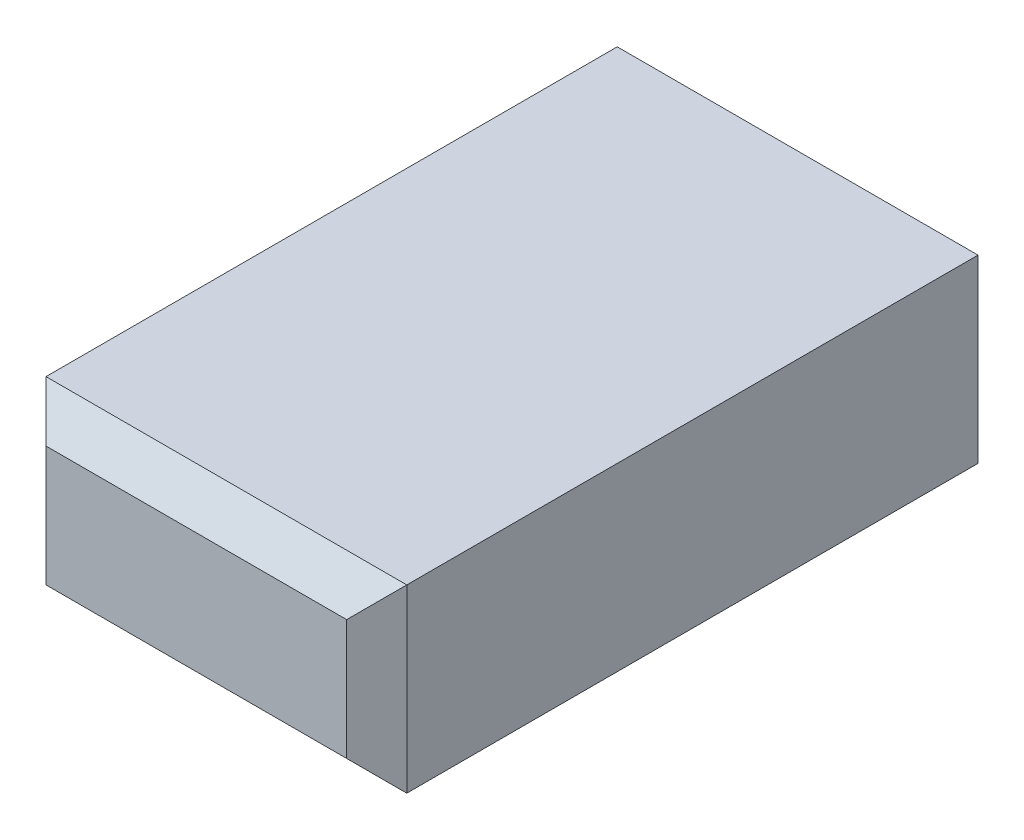
ISO-10303-21;
HEADER;
FILE_DESCRIPTION(('STEP AP214'),'2;1');
FILE_NAME('part.step','',(''),(''),'','','');
FILE_SCHEMA(('AUTOMOTIVE_DESIGN { 1 0 10303 214 1 1 1 1 }'));
ENDSEC;
DATA;
#1=APPLICATION_CONTEXT('core data for automotive mechanical design processes');
#2=APPLICATION_PROTOCOL_DEFINITION('international standard','automotive_design',2000,#1);
#3=PRODUCT_CONTEXT('',#1,'mechanical');
#4=PRODUCT('Part','Part','',(#3));
#5=PRODUCT_RELATED_PRODUCT_CATEGORY('part','',(#4));
#6=PRODUCT_DEFINITION_FORMATION('','',#4);
#7=PRODUCT_DEFINITION_CONTEXT('part definition',#1,'design');
#8=PRODUCT_DEFINITION('design','',#6,#7);
#9=PRODUCT_DEFINITION_SHAPE('','',#8);
#10=(LENGTH_UNIT() NAMED_UNIT(*) SI_UNIT(.MILLI.,.METRE.));
#11=(NAMED_UNIT(*) PLANE_ANGLE_UNIT() SI_UNIT($,.RADIAN.));
#12=(NAMED_UNIT(*) SI_UNIT($,.STERADIAN.) SOLID_ANGLE_UNIT());
#13=UNCERTAINTY_MEASURE_WITH_UNIT(LENGTH_MEASURE(1.E-05),#10,'distance_accuracy_value','');
#14=(GEOMETRIC_REPRESENTATION_CONTEXT(3) GLOBAL_UNCERTAINTY_ASSIGNED_CONTEXT((#13)) GLOBAL_UNIT_ASSIGNED_CONTEXT((#10,
#11,#12)) REPRESENTATION_CONTEXT('',''));
#15=CARTESIAN_POINT('',(0.,0.,0.));
#16=DIRECTION('',(0.,0.,1.));
#17=DIRECTION('',(1.,0.,0.));
#18=AXIS2_PLACEMENT_3D('',#15,#16,#17);
#19=CARTESIAN_POINT('',(-3.,-1.5,10.));
#20=DIRECTION('',(1.,0.,0.));
#21=DIRECTION('',(0.,0.,-1.));
#22=AXIS2_PLACEMENT_3D('',#19,#20,#21);
#23=PLANE('',#22);
#24=DIRECTION('',(0.,0.,-1.));
#25=VECTOR('',#24,1.);
#26=CARTESIAN_POINT('',(-3.,-1.5,10.));
#27=LINE('',#26,#25);
#28=CARTESIAN_POINT('',(-3.,-1.5,9.5));
#29=VERTEX_POINT('',#28);
#30=CARTESIAN_POINT('',(-3.,-1.5,0.));
#31=VERTEX_POINT('',#30);
#32=EDGE_CURVE('E88',#29,#31,#27,.T.);
#33=ORIENTED_EDGE('',*,*,#32,.F.);
#34=DIRECTION('',(0.,1.,0.));
#35=VECTOR('',#34,1.);
#36=CARTESIAN_POINT('',(-3.,1.5,9.5));
#37=LINE('',#36,#35);
#38=CARTESIAN_POINT('',(-3.,1.5,9.5));
#39=VERTEX_POINT('',#38);
#40=EDGE_CURVE('E11',#29,#39,#37,.T.);
#41=ORIENTED_EDGE('',*,*,#40,.T.);
#42=DIRECTION('',(0.,0.,-1.));
#43=VECTOR('',#42,1.);
#44=CARTESIAN_POINT('',(-3.,1.5,10.));
#45=LINE('',#44,#43);
#46=CARTESIAN_POINT('',(-3.,1.5,0.));
#47=VERTEX_POINT('',#46);
#48=EDGE_CURVE('E108',#39,#47,#45,.T.);
#49=ORIENTED_EDGE('',*,*,#48,.T.);
#50=DIRECTION('',(0.,-1.,0.));
#51=VECTOR('',#50,1.);
#52=CARTESIAN_POINT('',(-3.,-1.5,0.));
#53=LINE('',#52,#51);
#54=EDGE_CURVE('E103',#47,#31,#53,.T.);
#55=ORIENTED_EDGE('',*,*,#54,.T.);
#56=EDGE_LOOP('',(#33,#41,#49,#55));
#57=FACE_BOUND('',#56,.T.);
#58=ADVANCED_FACE('F35',(#57),#23,.F.);
#59=CARTESIAN_POINT('',(3.,-1.5,10.));
#60=DIRECTION('',(0.,1.,0.));
#61=DIRECTION('',(-1.,0.,0.));
#62=AXIS2_PLACEMENT_3D('',#59,#60,#61);
#63=PLANE('',#62);
#64=DIRECTION('',(0.,0.,-1.));
#65=VECTOR('',#64,1.);
#66=CARTESIAN_POINT('',(3.,-1.5,10.));
#67=LINE('',#66,#65);
#68=CARTESIAN_POINT('',(3.,-1.5,9.5));
#69=VERTEX_POINT('',#68);
#70=CARTESIAN_POINT('',(3.,-1.5,0.));
#71=VERTEX_POINT('',#70);
#72=EDGE_CURVE('E97',#69,#71,#67,.T.);
#73=ORIENTED_EDGE('',*,*,#72,.F.);
#74=DIRECTION('',(-1.,0.,0.));
#75=VECTOR('',#74,1.);
#76=CARTESIAN_POINT('',(-3.,-1.5,9.5));
#77=LINE('',#76,#75);
#78=EDGE_CURVE('E45',#69,#29,#77,.T.);
#79=ORIENTED_EDGE('',*,*,#78,.T.);
#80=ORIENTED_EDGE('',*,*,#32,.T.);
#81=DIRECTION('',(1.,0.,0.));
#82=VECTOR('',#81,1.);
#83=CARTESIAN_POINT('',(3.,-1.5,0.));
#84=LINE('',#83,#82);
#85=EDGE_CURVE('E91',#31,#71,#84,.T.);
#86=ORIENTED_EDGE('',*,*,#85,.T.);
#87=EDGE_LOOP('',(#73,#79,#80,#86));
#88=FACE_BOUND('',#87,.T.);
#89=ADVANCED_FACE('F90',(#88),#63,.F.);
#90=CARTESIAN_POINT('',(3.,-1.5,10.));
#91=DIRECTION('',(-1.,0.,0.));
#92=DIRECTION('',(0.,0.,1.));
#93=AXIS2_PLACEMENT_3D('',#90,#91,#92);
#94=PLANE('',#93);
#95=DIRECTION('',(0.,0.,-1.));
#96=VECTOR('',#95,1.);
#97=CARTESIAN_POINT('',(3.,1.5,10.));
#98=LINE('',#97,#96);
#99=CARTESIAN_POINT('',(3.,1.5,9.5));
#100=VERTEX_POINT('',#99);
#101=CARTESIAN_POINT('',(3.,1.5,0.));
#102=VERTEX_POINT('',#101);
#103=EDGE_CURVE('E118',#100,#102,#98,.T.);
#104=ORIENTED_EDGE('',*,*,#103,.F.);
#105=DIRECTION('',(0.,-1.,0.));
#106=VECTOR('',#105,1.);
#107=CARTESIAN_POINT('',(3.,-1.5,9.5));
#108=LINE('',#107,#106);
#109=EDGE_CURVE('E60',#100,#69,#108,.T.);
#110=ORIENTED_EDGE('',*,*,#109,.T.);
#111=ORIENTED_EDGE('',*,*,#72,.T.);
#112=DIRECTION('',(0.,1.,0.));
#113=VECTOR('',#112,1.);
#114=CARTESIAN_POINT('',(3.,-1.5,0.));
#115=LINE('',#114,#113);
#116=EDGE_CURVE('E105',#71,#102,#115,.T.);
#117=ORIENTED_EDGE('',*,*,#116,.T.);
#118=EDGE_LOOP('',(#104,#110,#111,#117));
#119=FACE_BOUND('',#118,.T.);
#120=ADVANCED_FACE('F156',(#119),#94,.F.);
#121=CARTESIAN_POINT('',(3.,1.5,10.));
#122=DIRECTION('',(0.,-1.,0.));
#123=DIRECTION('',(1.,0.,0.));
#124=AXIS2_PLACEMENT_3D('',#121,#122,#123);
#125=PLANE('',#124);
#126=ORIENTED_EDGE('',*,*,#48,.F.);
#127=DIRECTION('',(1.,0.,0.));
#128=VECTOR('',#127,1.);
#129=CARTESIAN_POINT('',(3.,1.5,9.5));
#130=LINE('',#129,#128);
#131=EDGE_CURVE('E129',#39,#100,#130,.T.);
#132=ORIENTED_EDGE('',*,*,#131,.T.);
#133=ORIENTED_EDGE('',*,*,#103,.T.);
#134=DIRECTION('',(-1.,0.,0.));
#135=VECTOR('',#134,1.);
#136=CARTESIAN_POINT('',(3.,1.5,0.));
#137=LINE('',#136,#135);
#138=EDGE_CURVE('E115',#102,#47,#137,.T.);
#139=ORIENTED_EDGE('',*,*,#138,.T.);
#140=EDGE_LOOP('',(#126,#132,#133,#139));
#141=FACE_BOUND('',#140,.T.);
#142=ADVANCED_FACE('F155',(#141),#125,.F.);
#143=CARTESIAN_POINT('',(0.,0.,10.));
#144=DIRECTION('',(0.,0.,1.));
#145=DIRECTION('',(1.,0.,0.));
#146=AXIS2_PLACEMENT_3D('',#143,#144,#145);
#147=PLANE('',#146);
#148=DIRECTION('',(0.,1.,0.));
#149=VECTOR('',#148,1.);
#150=CARTESIAN_POINT('',(2.5,1.5,10.));
#151=LINE('',#150,#149);
#152=CARTESIAN_POINT('',(2.5,-0.999999999999999,10.));
#153=VERTEX_POINT('',#152);
#154=CARTESIAN_POINT('',(2.5,1.,10.));
#155=VERTEX_POINT('',#154);
#156=EDGE_CURVE('E124',#153,#155,#151,.T.);
#157=ORIENTED_EDGE('',*,*,#156,.T.);
#158=DIRECTION('',(-1.,0.,0.));
#159=VECTOR('',#158,1.);
#160=CARTESIAN_POINT('',(-3.,0.999999999999999,10.));
#161=LINE('',#160,#159);
#162=CARTESIAN_POINT('',(-2.5,0.999999999999999,10.));
#163=VERTEX_POINT('',#162);
#164=EDGE_CURVE('E126',#155,#163,#161,.T.);
#165=ORIENTED_EDGE('',*,*,#164,.T.);
#166=DIRECTION('',(0.,-1.,0.));
#167=VECTOR('',#166,1.);
#168=CARTESIAN_POINT('',(-2.5,-1.5,10.));
#169=LINE('',#168,#167);
#170=CARTESIAN_POINT('',(-2.5,-1.,10.));
#171=VERTEX_POINT('',#170);
#172=EDGE_CURVE('E96',#163,#171,#169,.T.);
#173=ORIENTED_EDGE('',*,*,#172,.T.);
#174=DIRECTION('',(1.,0.,0.));
#175=VECTOR('',#174,1.);
#176=CARTESIAN_POINT('',(3.,-0.999999999999999,10.));
#177=LINE('',#176,#175);
#178=EDGE_CURVE('E122',#171,#153,#177,.T.);
#179=ORIENTED_EDGE('',*,*,#178,.T.);
#180=EDGE_LOOP('',(#157,#165,#173,#179));
#181=FACE_BOUND('',#180,.T.);
#182=ADVANCED_FACE('F148',(#181),#147,.T.);
#183=CARTESIAN_POINT('',(0.,0.,0.));
#184=DIRECTION('',(0.,0.,1.));
#185=DIRECTION('',(1.,0.,0.));
#186=AXIS2_PLACEMENT_3D('',#183,#184,#185);
#187=PLANE('',#186);
#188=ORIENTED_EDGE('',*,*,#54,.F.);
#189=ORIENTED_EDGE('',*,*,#138,.F.);
#190=ORIENTED_EDGE('',*,*,#116,.F.);
#191=ORIENTED_EDGE('',*,*,#85,.F.);
#192=EDGE_LOOP('',(#188,#189,#190,#191));
#193=FACE_BOUND('',#192,.T.);
#194=ADVANCED_FACE('F101',(#193),#187,.F.);
#195=CARTESIAN_POINT('',(0.,-1.,10.));
#196=DIRECTION('',(0.,-0.707106781186549,0.707106781186546));
#197=DIRECTION('',(-1.,0.,0.));
#198=AXIS2_PLACEMENT_3D('',#195,#196,#197);
#199=PLANE('',#198);
#200=DIRECTION('',(0.577350269189625,0.577350269189625,0.577350269189627));
#201=VECTOR('',#200,1.);
#202=CARTESIAN_POINT('',(-2.16666666666667,-0.666666666666668,10.3333333333333));
#203=LINE('',#202,#201);
#204=EDGE_CURVE('E112',#29,#171,#203,.T.);
#205=ORIENTED_EDGE('',*,*,#204,.F.);
#206=ORIENTED_EDGE('',*,*,#78,.F.);
#207=DIRECTION('',(-0.577350269189625,0.577350269189625,0.577350269189627));
#208=VECTOR('',#207,1.);
#209=CARTESIAN_POINT('',(1.66666666666667,-0.166666666666668,10.8333333333333));
#210=LINE('',#209,#208);
#211=EDGE_CURVE('E40',#153,#69,#210,.F.);
#212=ORIENTED_EDGE('',*,*,#211,.F.);
#213=ORIENTED_EDGE('',*,*,#178,.F.);
#214=EDGE_LOOP('',(#205,#206,#212,#213));
#215=FACE_BOUND('',#214,.T.);
#216=ADVANCED_FACE('F38',(#215),#199,.T.);
#217=CARTESIAN_POINT('',(2.5,0.,10.));
#218=DIRECTION('',(0.707106781186549,0.,0.707106781186546));
#219=DIRECTION('',(0.,-1.,0.));
#220=AXIS2_PLACEMENT_3D('',#217,#218,#219);
#221=PLANE('',#220);
#222=ORIENTED_EDGE('',*,*,#211,.T.);
#223=ORIENTED_EDGE('',*,*,#109,.F.);
#224=DIRECTION('',(-0.577350269189625,-0.577350269189625,0.577350269189627));
#225=VECTOR('',#224,1.);
#226=CARTESIAN_POINT('',(2.16666666666667,0.666666666666667,10.3333333333333));
#227=LINE('',#226,#225);
#228=EDGE_CURVE('E136',#155,#100,#227,.F.);
#229=ORIENTED_EDGE('',*,*,#228,.F.);
#230=ORIENTED_EDGE('',*,*,#156,.F.);
#231=EDGE_LOOP('',(#222,#223,#229,#230));
#232=FACE_BOUND('',#231,.T.);
#233=ADVANCED_FACE('F180',(#232),#221,.T.);
#234=CARTESIAN_POINT('',(-2.5,0.,10.));
#235=DIRECTION('',(-0.707106781186549,0.,0.707106781186546));
#236=DIRECTION('',(0.,1.,0.));
#237=AXIS2_PLACEMENT_3D('',#234,#235,#236);
#238=PLANE('',#237);
#239=ORIENTED_EDGE('',*,*,#204,.T.);
#240=ORIENTED_EDGE('',*,*,#172,.F.);
#241=DIRECTION('',(-0.577350269189625,0.577350269189625,-0.577350269189627));
#242=VECTOR('',#241,1.);
#243=CARTESIAN_POINT('',(-2.16666666666667,0.666666666666667,10.3333333333333));
#244=LINE('',#243,#242);
#245=EDGE_CURVE('E134',#39,#163,#244,.F.);
#246=ORIENTED_EDGE('',*,*,#245,.F.);
#247=ORIENTED_EDGE('',*,*,#40,.F.);
#248=EDGE_LOOP('',(#239,#240,#246,#247));
#249=FACE_BOUND('',#248,.T.);
#250=ADVANCED_FACE('F141',(#249),#238,.T.);
#251=CARTESIAN_POINT('',(0.,0.999999999999999,10.));
#252=DIRECTION('',(0.,0.707106781186549,0.707106781186546));
#253=DIRECTION('',(1.,0.,0.));
#254=AXIS2_PLACEMENT_3D('',#251,#252,#253);
#255=PLANE('',#254);
#256=ORIENTED_EDGE('',*,*,#228,.T.);
#257=ORIENTED_EDGE('',*,*,#131,.F.);
#258=ORIENTED_EDGE('',*,*,#245,.T.);
#259=ORIENTED_EDGE('',*,*,#164,.F.);
#260=EDGE_LOOP('',(#256,#257,#258,#259));
#261=FACE_BOUND('',#260,.T.);
#262=ADVANCED_FACE('F152',(#261),#255,.T.);
#263=CLOSED_SHELL('',(#58,#89,#120,#142,#182,#194,#216,#233,#250,#262));
#264=MANIFOLD_SOLID_BREP('B2',#263);
#265=ADVANCED_BREP_SHAPE_REPRESENTATION('',(#18,#264),#14);
#266=SHAPE_DEFINITION_REPRESENTATION(#9,#265);
ENDSEC;
END-ISO-10303-21;
